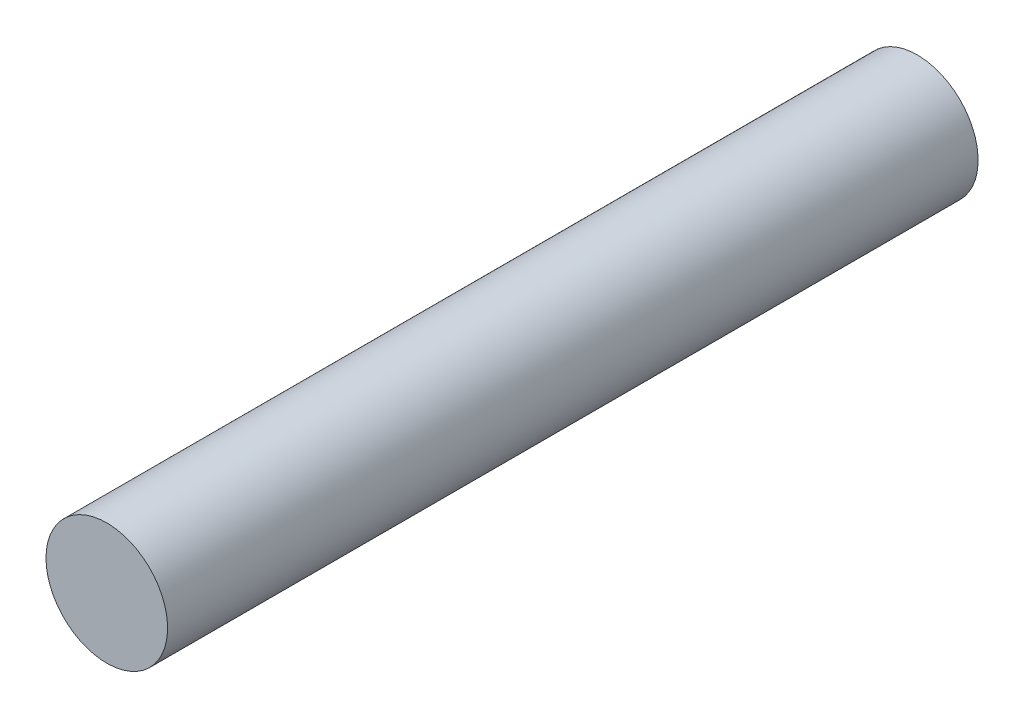
ISO-10303-21;
HEADER;
FILE_DESCRIPTION(('STEP AP214'),'2;1');
FILE_NAME('part.step','',(''),(''),'','','');
FILE_SCHEMA(('AUTOMOTIVE_DESIGN { 1 0 10303 214 1 1 1 1 }'));
ENDSEC;
DATA;
#1=APPLICATION_CONTEXT('core data for automotive mechanical design processes');
#2=APPLICATION_PROTOCOL_DEFINITION('international standard','automotive_design',2000,#1);
#3=PRODUCT_CONTEXT('',#1,'mechanical');
#4=PRODUCT('Part','Part','',(#3));
#5=PRODUCT_RELATED_PRODUCT_CATEGORY('part','',(#4));
#6=PRODUCT_DEFINITION_FORMATION('','',#4);
#7=PRODUCT_DEFINITION_CONTEXT('part definition',#1,'design');
#8=PRODUCT_DEFINITION('design','',#6,#7);
#9=PRODUCT_DEFINITION_SHAPE('','',#8);
#10=(LENGTH_UNIT() NAMED_UNIT(*) SI_UNIT(.MILLI.,.METRE.));
#11=(NAMED_UNIT(*) PLANE_ANGLE_UNIT() SI_UNIT($,.RADIAN.));
#12=(NAMED_UNIT(*) SI_UNIT($,.STERADIAN.) SOLID_ANGLE_UNIT());
#13=UNCERTAINTY_MEASURE_WITH_UNIT(LENGTH_MEASURE(1.E-05),#10,'distance_accuracy_value','');
#14=(GEOMETRIC_REPRESENTATION_CONTEXT(3) GLOBAL_UNCERTAINTY_ASSIGNED_CONTEXT((#13)) GLOBAL_UNIT_ASSIGNED_CONTEXT((#10,
#11,#12)) REPRESENTATION_CONTEXT('',''));
#15=CARTESIAN_POINT('',(0.,0.,0.));
#16=DIRECTION('',(0.,0.,1.));
#17=DIRECTION('',(1.,0.,0.));
#18=AXIS2_PLACEMENT_3D('',#15,#16,#17);
#19=CARTESIAN_POINT('',(20.32,8.88,-3.));
#20=DIRECTION('',(0.,0.,1.));
#21=DIRECTION('',(1.,0.,0.));
#22=AXIS2_PLACEMENT_3D('',#19,#20,#21);
#23=PLANE('',#22);
#24=CARTESIAN_POINT('',(20.32,8.88,-3.));
#25=DIRECTION('',(0.,0.,-1.));
#26=DIRECTION('',(-1.,0.,0.));
#27=AXIS2_PLACEMENT_3D('',#24,#25,#26);
#28=CIRCLE('',#27,0.225);
#29=CARTESIAN_POINT('',(20.095,8.88,-3.));
#30=VERTEX_POINT('',#29);
#31=EDGE_CURVE('E17',#30,#30,#28,.F.);
#32=ORIENTED_EDGE('',*,*,#31,.F.);
#33=EDGE_LOOP('',(#32));
#34=FACE_BOUND('',#33,.T.);
#35=ADVANCED_FACE('F14',(#34),#23,.F.);
#36=CARTESIAN_POINT('',(20.32,8.88,0.));
#37=DIRECTION('',(0.,0.,1.));
#38=DIRECTION('',(1.,0.,0.));
#39=AXIS2_PLACEMENT_3D('',#36,#37,#38);
#40=PLANE('',#39);
#41=CARTESIAN_POINT('',(20.32,8.88,0.));
#42=DIRECTION('',(0.,0.,-1.));
#43=DIRECTION('',(-1.,0.,0.));
#44=AXIS2_PLACEMENT_3D('',#41,#42,#43);
#45=CIRCLE('',#44,0.225);
#46=CARTESIAN_POINT('',(20.095,8.88,0.));
#47=VERTEX_POINT('',#46);
#48=EDGE_CURVE('E10',#47,#47,#45,.T.);
#49=ORIENTED_EDGE('',*,*,#48,.F.);
#50=EDGE_LOOP('',(#49));
#51=FACE_BOUND('',#50,.T.);
#52=ADVANCED_FACE('F29',(#51),#40,.T.);
#53=CARTESIAN_POINT('',(20.32,8.88,0.));
#54=DIRECTION('',(0.,0.,-1.));
#55=DIRECTION('',(-1.,0.,0.));
#56=AXIS2_PLACEMENT_3D('',#53,#54,#55);
#57=CYLINDRICAL_SURFACE('',#56,0.225);
#58=ORIENTED_EDGE('',*,*,#48,.T.);
#59=EDGE_LOOP('',(#58));
#60=FACE_BOUND('',#59,.T.);
#61=ORIENTED_EDGE('',*,*,#31,.T.);
#62=EDGE_LOOP('',(#61));
#63=FACE_BOUND('',#62,.T.);
#64=ADVANCED_FACE('F26',(#60,#63),#57,.T.);
#65=CLOSED_SHELL('',(#35,#52,#64));
#66=MANIFOLD_SOLID_BREP('B1',#65);
#67=ADVANCED_BREP_SHAPE_REPRESENTATION('',(#18,#66),#14);
#68=SHAPE_DEFINITION_REPRESENTATION(#9,#67);
ENDSEC;
END-ISO-10303-21;
